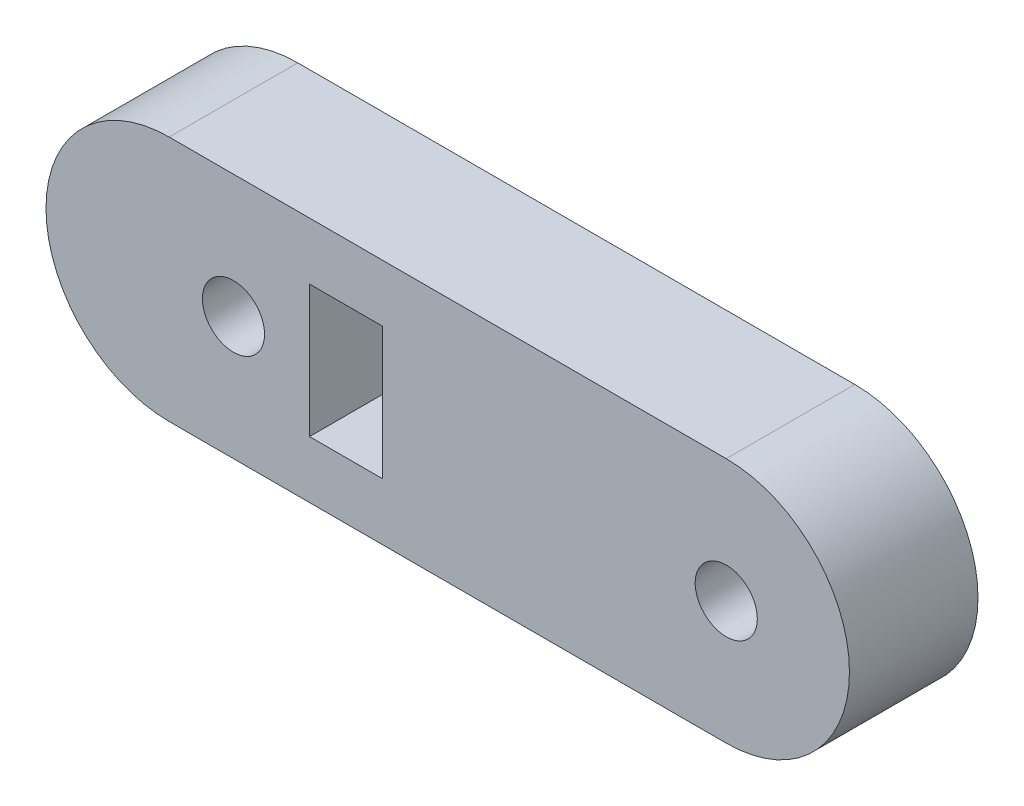
ISO-10303-21;
HEADER;
FILE_DESCRIPTION(('STEP AP214'),'2;1');
FILE_NAME('part.step','',(''),(''),'','','');
FILE_SCHEMA(('AUTOMOTIVE_DESIGN { 1 0 10303 214 1 1 1 1 }'));
ENDSEC;
DATA;
#1=APPLICATION_CONTEXT('core data for automotive mechanical design processes');
#2=APPLICATION_PROTOCOL_DEFINITION('international standard','automotive_design',2000,#1);
#3=PRODUCT_CONTEXT('',#1,'mechanical');
#4=PRODUCT('Part','Part','',(#3));
#5=PRODUCT_RELATED_PRODUCT_CATEGORY('part','',(#4));
#6=PRODUCT_DEFINITION_FORMATION('','',#4);
#7=PRODUCT_DEFINITION_CONTEXT('part definition',#1,'design');
#8=PRODUCT_DEFINITION('design','',#6,#7);
#9=PRODUCT_DEFINITION_SHAPE('','',#8);
#10=(LENGTH_UNIT() NAMED_UNIT(*) SI_UNIT(.MILLI.,.METRE.));
#11=(NAMED_UNIT(*) PLANE_ANGLE_UNIT() SI_UNIT($,.RADIAN.));
#12=(NAMED_UNIT(*) SI_UNIT($,.STERADIAN.) SOLID_ANGLE_UNIT());
#13=UNCERTAINTY_MEASURE_WITH_UNIT(LENGTH_MEASURE(1.E-05),#10,'distance_accuracy_value','');
#14=(GEOMETRIC_REPRESENTATION_CONTEXT(3) GLOBAL_UNCERTAINTY_ASSIGNED_CONTEXT((#13)) GLOBAL_UNIT_ASSIGNED_CONTEXT((#10,
#11,#12)) REPRESENTATION_CONTEXT('',''));
#15=CARTESIAN_POINT('',(0.,0.,0.));
#16=DIRECTION('',(0.,0.,1.));
#17=DIRECTION('',(1.,0.,0.));
#18=AXIS2_PLACEMENT_3D('',#15,#16,#17);
#19=CARTESIAN_POINT('',(586.771387999998,460.482899,6.));
#20=DIRECTION('',(0.,0.,1.));
#21=DIRECTION('',(1.,0.,0.));
#22=AXIS2_PLACEMENT_3D('',#19,#20,#21);
#23=PLANE('',#22);
#24=CARTESIAN_POINT('',(612.771387999999,460.482899,6.));
#25=DIRECTION('',(0.,0.,1.));
#26=DIRECTION('',(1.,0.,0.));
#27=AXIS2_PLACEMENT_3D('',#24,#25,#26);
#28=CIRCLE('',#27,1.44999999999994);
#29=CARTESIAN_POINT('',(614.221387999999,460.482899,6.));
#30=VERTEX_POINT('',#29);
#31=EDGE_CURVE('E136',#30,#30,#28,.T.);
#32=ORIENTED_EDGE('',*,*,#31,.F.);
#33=EDGE_LOOP('',(#32));
#34=FACE_BOUND('',#33,.T.);
#35=DIRECTION('',(1.,0.,0.));
#36=VECTOR('',#35,1.);
#37=CARTESIAN_POINT('',(589.771387999999,454.732899,6.));
#38=LINE('',#37,#36);
#39=CARTESIAN_POINT('',(586.771387999998,454.732899,6.));
#40=VERTEX_POINT('',#39);
#41=CARTESIAN_POINT('',(612.771387999999,454.732899,6.));
#42=VERTEX_POINT('',#41);
#43=EDGE_CURVE('E148',#40,#42,#38,.T.);
#44=ORIENTED_EDGE('',*,*,#43,.T.);
#45=CARTESIAN_POINT('',(612.771387999999,460.482899,6.));
#46=DIRECTION('',(0.,0.,1.));
#47=DIRECTION('',(1.,0.,0.));
#48=AXIS2_PLACEMENT_3D('',#45,#46,#47);
#49=CIRCLE('',#48,5.74999999999998);
#50=CARTESIAN_POINT('',(612.771387999999,466.232899,6.));
#51=VERTEX_POINT('',#50);
#52=EDGE_CURVE('E150',#42,#51,#49,.T.);
#53=ORIENTED_EDGE('',*,*,#52,.T.);
#54=DIRECTION('',(-1.,0.,0.));
#55=VECTOR('',#54,1.);
#56=CARTESIAN_POINT('',(589.771387999999,466.232899,6.));
#57=LINE('',#56,#55);
#58=CARTESIAN_POINT('',(586.771387999998,466.232899,6.));
#59=VERTEX_POINT('',#58);
#60=EDGE_CURVE('E153',#51,#59,#57,.T.);
#61=ORIENTED_EDGE('',*,*,#60,.T.);
#62=CARTESIAN_POINT('',(586.771387999998,460.482899,6.));
#63=DIRECTION('',(0.,0.,1.));
#64=DIRECTION('',(1.,0.,0.));
#65=AXIS2_PLACEMENT_3D('',#62,#63,#64);
#66=CIRCLE('',#65,5.74999999999998);
#67=EDGE_CURVE('E155',#59,#40,#66,.T.);
#68=ORIENTED_EDGE('',*,*,#67,.T.);
#69=EDGE_LOOP('',(#44,#53,#61,#68));
#70=FACE_BOUND('',#69,.T.);
#71=CARTESIAN_POINT('',(589.771387999998,460.482899,6.));
#72=DIRECTION('',(0.,0.,1.));
#73=DIRECTION('',(1.,0.,0.));
#74=AXIS2_PLACEMENT_3D('',#71,#72,#73);
#75=CIRCLE('',#74,1.45000000000015);
#76=CARTESIAN_POINT('',(591.221387999999,460.482899,6.));
#77=VERTEX_POINT('',#76);
#78=EDGE_CURVE('E142',#77,#77,#75,.T.);
#79=ORIENTED_EDGE('',*,*,#78,.F.);
#80=EDGE_LOOP('',(#79));
#81=FACE_BOUND('',#80,.T.);
#82=DIRECTION('',(0.,-1.,0.));
#83=VECTOR('',#82,1.);
#84=CARTESIAN_POINT('',(593.321387999998,457.400399,6.));
#85=LINE('',#84,#83);
#86=CARTESIAN_POINT('',(593.321387999998,463.565399,6.));
#87=VERTEX_POINT('',#86);
#88=CARTESIAN_POINT('',(593.321387999998,457.400399,6.));
#89=VERTEX_POINT('',#88);
#90=EDGE_CURVE('E108',#87,#89,#85,.T.);
#91=ORIENTED_EDGE('',*,*,#90,.F.);
#92=DIRECTION('',(-1.,0.,0.));
#93=VECTOR('',#92,1.);
#94=CARTESIAN_POINT('',(593.321387999998,463.565399,6.));
#95=LINE('',#94,#93);
#96=CARTESIAN_POINT('',(596.721387999998,463.565399,6.));
#97=VERTEX_POINT('',#96);
#98=EDGE_CURVE('E100',#97,#87,#95,.T.);
#99=ORIENTED_EDGE('',*,*,#98,.F.);
#100=DIRECTION('',(0.,1.,0.));
#101=VECTOR('',#100,1.);
#102=CARTESIAN_POINT('',(596.721387999998,463.565399,6.));
#103=LINE('',#102,#101);
#104=CARTESIAN_POINT('',(596.721387999998,457.400399,6.));
#105=VERTEX_POINT('',#104);
#106=EDGE_CURVE('E122',#105,#97,#103,.T.);
#107=ORIENTED_EDGE('',*,*,#106,.F.);
#108=DIRECTION('',(1.,0.,0.));
#109=VECTOR('',#108,1.);
#110=CARTESIAN_POINT('',(596.721387999998,457.400399,6.));
#111=LINE('',#110,#109);
#112=EDGE_CURVE('E120',#89,#105,#111,.T.);
#113=ORIENTED_EDGE('',*,*,#112,.F.);
#114=EDGE_LOOP('',(#91,#99,#107,#113));
#115=FACE_BOUND('',#114,.T.);
#116=ADVANCED_FACE('F35',(#34,#70,#81,#115),#23,.T.);
#117=CARTESIAN_POINT('',(586.771387999998,460.482899,0.));
#118=DIRECTION('',(0.,0.,1.));
#119=DIRECTION('',(1.,0.,0.));
#120=AXIS2_PLACEMENT_3D('',#117,#118,#119);
#121=PLANE('',#120);
#122=CARTESIAN_POINT('',(612.771387999999,460.482899,0.));
#123=DIRECTION('',(0.,0.,1.));
#124=DIRECTION('',(1.,0.,0.));
#125=AXIS2_PLACEMENT_3D('',#122,#123,#124);
#126=CIRCLE('',#125,1.44999999999994);
#127=CARTESIAN_POINT('',(614.221387999999,460.482899,0.));
#128=VERTEX_POINT('',#127);
#129=EDGE_CURVE('E116',#128,#128,#126,.T.);
#130=ORIENTED_EDGE('',*,*,#129,.T.);
#131=EDGE_LOOP('',(#130));
#132=FACE_BOUND('',#131,.T.);
#133=DIRECTION('',(1.,0.,0.));
#134=VECTOR('',#133,1.);
#135=CARTESIAN_POINT('',(589.771387999999,454.732899,0.));
#136=LINE('',#135,#134);
#137=CARTESIAN_POINT('',(586.771387999998,454.732899,0.));
#138=VERTEX_POINT('',#137);
#139=CARTESIAN_POINT('',(612.771387999999,454.732899,0.));
#140=VERTEX_POINT('',#139);
#141=EDGE_CURVE('E145',#138,#140,#136,.T.);
#142=ORIENTED_EDGE('',*,*,#141,.F.);
#143=CARTESIAN_POINT('',(586.771387999998,460.482899,0.));
#144=DIRECTION('',(0.,0.,1.));
#145=DIRECTION('',(1.,0.,0.));
#146=AXIS2_PLACEMENT_3D('',#143,#144,#145);
#147=CIRCLE('',#146,5.74999999999998);
#148=CARTESIAN_POINT('',(586.771387999998,466.232899,0.));
#149=VERTEX_POINT('',#148);
#150=EDGE_CURVE('E151',#149,#138,#147,.T.);
#151=ORIENTED_EDGE('',*,*,#150,.F.);
#152=DIRECTION('',(-1.,0.,0.));
#153=VECTOR('',#152,1.);
#154=CARTESIAN_POINT('',(589.771387999999,466.232899,0.));
#155=LINE('',#154,#153);
#156=CARTESIAN_POINT('',(612.771387999999,466.232899,0.));
#157=VERTEX_POINT('',#156);
#158=EDGE_CURVE('E162',#157,#149,#155,.T.);
#159=ORIENTED_EDGE('',*,*,#158,.F.);
#160=CARTESIAN_POINT('',(612.771387999999,460.482899,0.));
#161=DIRECTION('',(0.,0.,1.));
#162=DIRECTION('',(1.,0.,0.));
#163=AXIS2_PLACEMENT_3D('',#160,#161,#162);
#164=CIRCLE('',#163,5.74999999999998);
#165=EDGE_CURVE('E159',#140,#157,#164,.T.);
#166=ORIENTED_EDGE('',*,*,#165,.F.);
#167=EDGE_LOOP('',(#142,#151,#159,#166));
#168=FACE_BOUND('',#167,.T.);
#169=CARTESIAN_POINT('',(589.771387999998,460.482899,0.));
#170=DIRECTION('',(0.,0.,1.));
#171=DIRECTION('',(1.,0.,0.));
#172=AXIS2_PLACEMENT_3D('',#169,#170,#171);
#173=CIRCLE('',#172,1.45000000000015);
#174=CARTESIAN_POINT('',(591.221387999999,460.482899,0.));
#175=VERTEX_POINT('',#174);
#176=EDGE_CURVE('E139',#175,#175,#173,.T.);
#177=ORIENTED_EDGE('',*,*,#176,.T.);
#178=EDGE_LOOP('',(#177));
#179=FACE_BOUND('',#178,.T.);
#180=DIRECTION('',(-1.,0.,0.));
#181=VECTOR('',#180,1.);
#182=CARTESIAN_POINT('',(593.321387999998,463.565399,0.));
#183=LINE('',#182,#181);
#184=CARTESIAN_POINT('',(596.721387999998,463.565399,0.));
#185=VERTEX_POINT('',#184);
#186=CARTESIAN_POINT('',(593.321387999998,463.565399,0.));
#187=VERTEX_POINT('',#186);
#188=EDGE_CURVE('E58',#185,#187,#183,.T.);
#189=ORIENTED_EDGE('',*,*,#188,.T.);
#190=DIRECTION('',(0.,-1.,0.));
#191=VECTOR('',#190,1.);
#192=CARTESIAN_POINT('',(593.321387999998,457.400399,0.));
#193=LINE('',#192,#191);
#194=CARTESIAN_POINT('',(593.321387999998,457.400399,0.));
#195=VERTEX_POINT('',#194);
#196=EDGE_CURVE('E115',#187,#195,#193,.T.);
#197=ORIENTED_EDGE('',*,*,#196,.T.);
#198=DIRECTION('',(1.,0.,0.));
#199=VECTOR('',#198,1.);
#200=CARTESIAN_POINT('',(596.721387999998,457.400399,0.));
#201=LINE('',#200,#199);
#202=CARTESIAN_POINT('',(596.721387999998,457.400399,0.));
#203=VERTEX_POINT('',#202);
#204=EDGE_CURVE('E128',#195,#203,#201,.T.);
#205=ORIENTED_EDGE('',*,*,#204,.T.);
#206=DIRECTION('',(0.,1.,0.));
#207=VECTOR('',#206,1.);
#208=CARTESIAN_POINT('',(596.721387999998,463.565399,0.));
#209=LINE('',#208,#207);
#210=EDGE_CURVE('E109',#203,#185,#209,.T.);
#211=ORIENTED_EDGE('',*,*,#210,.T.);
#212=EDGE_LOOP('',(#189,#197,#205,#211));
#213=FACE_BOUND('',#212,.T.);
#214=ADVANCED_FACE('F182',(#132,#168,#179,#213),#121,.F.);
#215=CARTESIAN_POINT('',(589.771387999999,454.732899,6.));
#216=DIRECTION('',(0.,1.,0.));
#217=DIRECTION('',(0.,0.,1.));
#218=AXIS2_PLACEMENT_3D('',#215,#216,#217);
#219=PLANE('',#218);
#220=ORIENTED_EDGE('',*,*,#141,.T.);
#221=DIRECTION('',(0.,0.,-1.));
#222=VECTOR('',#221,1.);
#223=CARTESIAN_POINT('',(612.771387999999,454.732899,6.));
#224=LINE('',#223,#222);
#225=EDGE_CURVE('E11',#42,#140,#224,.T.);
#226=ORIENTED_EDGE('',*,*,#225,.F.);
#227=ORIENTED_EDGE('',*,*,#43,.F.);
#228=DIRECTION('',(0.,0.,-1.));
#229=VECTOR('',#228,1.);
#230=CARTESIAN_POINT('',(586.771387999998,454.732899,6.));
#231=LINE('',#230,#229);
#232=EDGE_CURVE('E157',#40,#138,#231,.T.);
#233=ORIENTED_EDGE('',*,*,#232,.T.);
#234=EDGE_LOOP('',(#220,#226,#227,#233));
#235=FACE_BOUND('',#234,.T.);
#236=ADVANCED_FACE('F37',(#235),#219,.F.);
#237=CARTESIAN_POINT('',(612.771387999999,460.482899,6.));
#238=DIRECTION('',(0.,0.,-1.));
#239=DIRECTION('',(-1.,0.,0.));
#240=AXIS2_PLACEMENT_3D('',#237,#238,#239);
#241=CYLINDRICAL_SURFACE('',#240,5.74999999999998);
#242=ORIENTED_EDGE('',*,*,#165,.T.);
#243=DIRECTION('',(0.,0.,-1.));
#244=VECTOR('',#243,1.);
#245=CARTESIAN_POINT('',(612.771387999999,466.232899,6.));
#246=LINE('',#245,#244);
#247=EDGE_CURVE('E43',#51,#157,#246,.T.);
#248=ORIENTED_EDGE('',*,*,#247,.F.);
#249=ORIENTED_EDGE('',*,*,#52,.F.);
#250=ORIENTED_EDGE('',*,*,#225,.T.);
#251=EDGE_LOOP('',(#242,#248,#249,#250));
#252=FACE_BOUND('',#251,.T.);
#253=ADVANCED_FACE('F178',(#252),#241,.T.);
#254=CARTESIAN_POINT('',(589.771387999999,466.232899,6.));
#255=DIRECTION('',(0.,-1.,0.));
#256=DIRECTION('',(0.,0.,-1.));
#257=AXIS2_PLACEMENT_3D('',#254,#255,#256);
#258=PLANE('',#257);
#259=ORIENTED_EDGE('',*,*,#158,.T.);
#260=DIRECTION('',(0.,0.,-1.));
#261=VECTOR('',#260,1.);
#262=CARTESIAN_POINT('',(586.771387999998,466.232899,6.));
#263=LINE('',#262,#261);
#264=EDGE_CURVE('E168',#59,#149,#263,.T.);
#265=ORIENTED_EDGE('',*,*,#264,.F.);
#266=ORIENTED_EDGE('',*,*,#60,.F.);
#267=ORIENTED_EDGE('',*,*,#247,.T.);
#268=EDGE_LOOP('',(#259,#265,#266,#267));
#269=FACE_BOUND('',#268,.T.);
#270=ADVANCED_FACE('F174',(#269),#258,.F.);
#271=CARTESIAN_POINT('',(586.771387999998,460.482899,6.));
#272=DIRECTION('',(0.,0.,-1.));
#273=DIRECTION('',(-1.,0.,0.));
#274=AXIS2_PLACEMENT_3D('',#271,#272,#273);
#275=CYLINDRICAL_SURFACE('',#274,5.74999999999998);
#276=ORIENTED_EDGE('',*,*,#150,.T.);
#277=ORIENTED_EDGE('',*,*,#232,.F.);
#278=ORIENTED_EDGE('',*,*,#67,.F.);
#279=ORIENTED_EDGE('',*,*,#264,.T.);
#280=EDGE_LOOP('',(#276,#277,#278,#279));
#281=FACE_BOUND('',#280,.T.);
#282=ADVANCED_FACE('F187',(#281),#275,.T.);
#283=CARTESIAN_POINT('',(589.771387999998,460.482899,6.));
#284=DIRECTION('',(0.,0.,-1.));
#285=DIRECTION('',(-1.,0.,0.));
#286=AXIS2_PLACEMENT_3D('',#283,#284,#285);
#287=CYLINDRICAL_SURFACE('',#286,1.45000000000015);
#288=ORIENTED_EDGE('',*,*,#78,.T.);
#289=EDGE_LOOP('',(#288));
#290=FACE_BOUND('',#289,.T.);
#291=ORIENTED_EDGE('',*,*,#176,.F.);
#292=EDGE_LOOP('',(#291));
#293=FACE_BOUND('',#292,.T.);
#294=ADVANCED_FACE('F198',(#290,#293),#287,.F.);
#295=CARTESIAN_POINT('',(612.771387999999,460.482899,6.));
#296=DIRECTION('',(0.,0.,-1.));
#297=DIRECTION('',(-1.,0.,0.));
#298=AXIS2_PLACEMENT_3D('',#295,#296,#297);
#299=CYLINDRICAL_SURFACE('',#298,1.44999999999994);
#300=ORIENTED_EDGE('',*,*,#31,.T.);
#301=EDGE_LOOP('',(#300));
#302=FACE_BOUND('',#301,.T.);
#303=ORIENTED_EDGE('',*,*,#129,.F.);
#304=EDGE_LOOP('',(#303));
#305=FACE_BOUND('',#304,.T.);
#306=ADVANCED_FACE('F201',(#302,#305),#299,.F.);
#307=CARTESIAN_POINT('',(593.321387999998,463.565399,6.));
#308=DIRECTION('',(0.,-1.,0.));
#309=DIRECTION('',(1.,0.,0.));
#310=AXIS2_PLACEMENT_3D('',#307,#308,#309);
#311=PLANE('',#310);
#312=ORIENTED_EDGE('',*,*,#188,.F.);
#313=DIRECTION('',(0.,0.,-1.));
#314=VECTOR('',#313,1.);
#315=CARTESIAN_POINT('',(596.721387999998,463.565399,6.));
#316=LINE('',#315,#314);
#317=EDGE_CURVE('E104',#97,#185,#316,.T.);
#318=ORIENTED_EDGE('',*,*,#317,.F.);
#319=ORIENTED_EDGE('',*,*,#98,.T.);
#320=DIRECTION('',(0.,0.,-1.));
#321=VECTOR('',#320,1.);
#322=CARTESIAN_POINT('',(593.321387999998,463.565399,6.));
#323=LINE('',#322,#321);
#324=EDGE_CURVE('E103',#87,#187,#323,.T.);
#325=ORIENTED_EDGE('',*,*,#324,.T.);
#326=EDGE_LOOP('',(#312,#318,#319,#325));
#327=FACE_BOUND('',#326,.T.);
#328=ADVANCED_FACE('F102',(#327),#311,.T.);
#329=CARTESIAN_POINT('',(593.321387999998,457.400399,6.));
#330=DIRECTION('',(1.,0.,0.));
#331=DIRECTION('',(0.,0.,-1.));
#332=AXIS2_PLACEMENT_3D('',#329,#330,#331);
#333=PLANE('',#332);
#334=ORIENTED_EDGE('',*,*,#196,.F.);
#335=ORIENTED_EDGE('',*,*,#324,.F.);
#336=ORIENTED_EDGE('',*,*,#90,.T.);
#337=DIRECTION('',(0.,0.,-1.));
#338=VECTOR('',#337,1.);
#339=CARTESIAN_POINT('',(593.321387999998,457.400399,6.));
#340=LINE('',#339,#338);
#341=EDGE_CURVE('E117',#89,#195,#340,.T.);
#342=ORIENTED_EDGE('',*,*,#341,.T.);
#343=EDGE_LOOP('',(#334,#335,#336,#342));
#344=FACE_BOUND('',#343,.T.);
#345=ADVANCED_FACE('F112',(#344),#333,.T.);
#346=CARTESIAN_POINT('',(596.721387999998,457.400399,6.));
#347=DIRECTION('',(0.,1.,0.));
#348=DIRECTION('',(-1.,0.,0.));
#349=AXIS2_PLACEMENT_3D('',#346,#347,#348);
#350=PLANE('',#349);
#351=ORIENTED_EDGE('',*,*,#204,.F.);
#352=ORIENTED_EDGE('',*,*,#341,.F.);
#353=ORIENTED_EDGE('',*,*,#112,.T.);
#354=DIRECTION('',(0.,0.,-1.));
#355=VECTOR('',#354,1.);
#356=CARTESIAN_POINT('',(596.721387999998,457.400399,6.));
#357=LINE('',#356,#355);
#358=EDGE_CURVE('E50',#105,#203,#357,.T.);
#359=ORIENTED_EDGE('',*,*,#358,.T.);
#360=EDGE_LOOP('',(#351,#352,#353,#359));
#361=FACE_BOUND('',#360,.T.);
#362=ADVANCED_FACE('F211',(#361),#350,.T.);
#363=CARTESIAN_POINT('',(596.721387999998,463.565399,6.));
#364=DIRECTION('',(-1.,0.,0.));
#365=DIRECTION('',(0.,0.,1.));
#366=AXIS2_PLACEMENT_3D('',#363,#364,#365);
#367=PLANE('',#366);
#368=ORIENTED_EDGE('',*,*,#210,.F.);
#369=ORIENTED_EDGE('',*,*,#358,.F.);
#370=ORIENTED_EDGE('',*,*,#106,.T.);
#371=ORIENTED_EDGE('',*,*,#317,.T.);
#372=EDGE_LOOP('',(#368,#369,#370,#371));
#373=FACE_BOUND('',#372,.T.);
#374=ADVANCED_FACE('F209',(#373),#367,.T.);
#375=CLOSED_SHELL('',(#116,#214,#236,#253,#270,#282,#294,#306,#328,#345,#362,#374));
#376=MANIFOLD_SOLID_BREP('B2',#375);
#377=ADVANCED_BREP_SHAPE_REPRESENTATION('',(#18,#376),#14);
#378=SHAPE_DEFINITION_REPRESENTATION(#9,#377);
ENDSEC;
END-ISO-10303-21;
